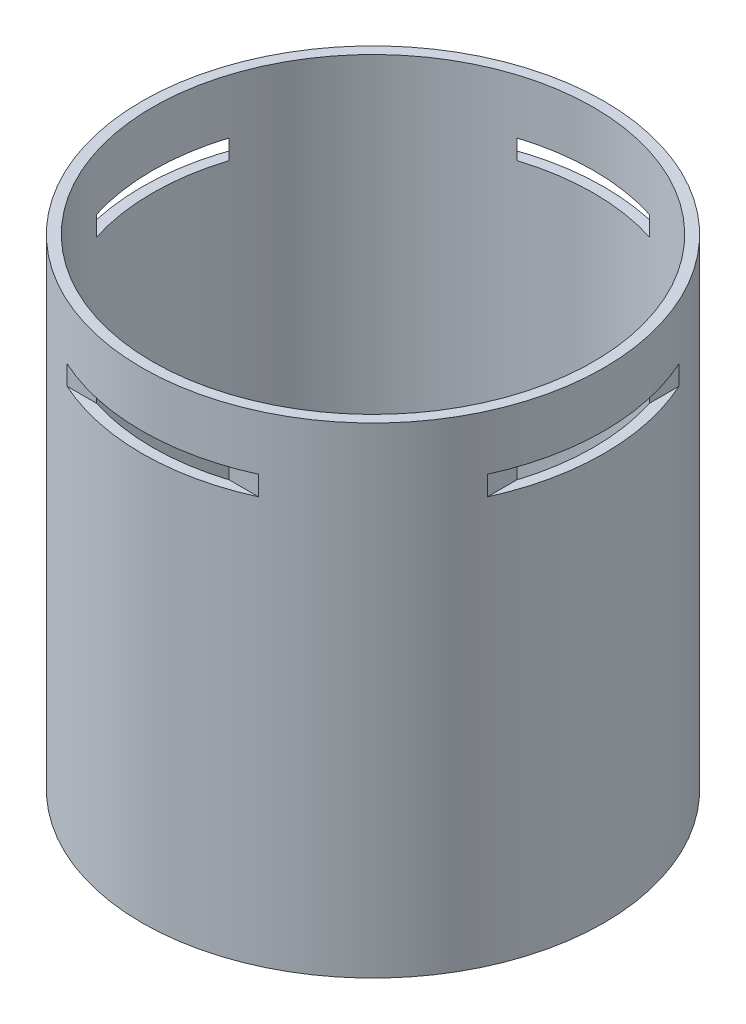
ISO-10303-21;
HEADER;
FILE_DESCRIPTION(('STEP AP214'),'2;1');
FILE_NAME('part.step','',(''),(''),'','','');
FILE_SCHEMA(('AUTOMOTIVE_DESIGN { 1 0 10303 214 1 1 1 1 }'));
ENDSEC;
DATA;
#1=APPLICATION_CONTEXT('core data for automotive mechanical design processes');
#2=APPLICATION_PROTOCOL_DEFINITION('international standard','automotive_design',2000,#1);
#3=PRODUCT_CONTEXT('',#1,'mechanical');
#4=PRODUCT('Part','Part','',(#3));
#5=PRODUCT_RELATED_PRODUCT_CATEGORY('part','',(#4));
#6=PRODUCT_DEFINITION_FORMATION('','',#4);
#7=PRODUCT_DEFINITION_CONTEXT('part definition',#1,'design');
#8=PRODUCT_DEFINITION('design','',#6,#7);
#9=PRODUCT_DEFINITION_SHAPE('','',#8);
#10=(LENGTH_UNIT() NAMED_UNIT(*) SI_UNIT(.MILLI.,.METRE.));
#11=(NAMED_UNIT(*) PLANE_ANGLE_UNIT() SI_UNIT($,.RADIAN.));
#12=(NAMED_UNIT(*) SI_UNIT($,.STERADIAN.) SOLID_ANGLE_UNIT());
#13=UNCERTAINTY_MEASURE_WITH_UNIT(LENGTH_MEASURE(1.E-05),#10,'distance_accuracy_value','');
#14=(GEOMETRIC_REPRESENTATION_CONTEXT(3) GLOBAL_UNCERTAINTY_ASSIGNED_CONTEXT((#13)) GLOBAL_UNIT_ASSIGNED_CONTEXT((#10,
#11,#12)) REPRESENTATION_CONTEXT('',''));
#15=CARTESIAN_POINT('',(0.,0.,0.));
#16=DIRECTION('',(0.,0.,1.));
#17=DIRECTION('',(1.,0.,0.));
#18=AXIS2_PLACEMENT_3D('',#15,#16,#17);
#19=CARTESIAN_POINT('',(0.,61.5,0.));
#20=DIRECTION('',(0.,-1.,0.));
#21=DIRECTION('',(0.,0.,-1.));
#22=AXIS2_PLACEMENT_3D('',#19,#20,#21);
#23=CYLINDRICAL_SURFACE('',#22,29.55);
#24=DIRECTION('',(0.,1.,0.));
#25=VECTOR('',#24,1.);
#26=CARTESIAN_POINT('',(-26.8912625214958,52.00000003,12.2499999999997));
#27=LINE('',#26,#25);
#28=CARTESIAN_POINT('',(-26.8912625214958,52.00000003,12.2499999999997));
#29=VERTEX_POINT('',#28);
#30=CARTESIAN_POINT('',(-26.8912625214958,54.50000003,12.2499999999997));
#31=VERTEX_POINT('',#30);
#32=EDGE_CURVE('E157',#29,#31,#27,.T.);
#33=ORIENTED_EDGE('',*,*,#32,.F.);
#34=CARTESIAN_POINT('',(0.,52.00000003,0.));
#35=DIRECTION('',(0.,1.,0.));
#36=DIRECTION('',(0.,0.,-1.));
#37=AXIS2_PLACEMENT_3D('',#34,#35,#36);
#38=CIRCLE('',#37,29.55);
#39=CARTESIAN_POINT('',(-26.8912625214956,52.00000003,-12.2500000000003));
#40=VERTEX_POINT('',#39);
#41=EDGE_CURVE('E144',#40,#29,#38,.T.);
#42=ORIENTED_EDGE('',*,*,#41,.F.);
#43=DIRECTION('',(0.,1.,0.));
#44=VECTOR('',#43,1.);
#45=CARTESIAN_POINT('',(-26.8912625214956,52.00000003,-12.2500000000003));
#46=LINE('',#45,#44);
#47=CARTESIAN_POINT('',(-26.8912625214956,54.50000003,-12.2500000000003));
#48=VERTEX_POINT('',#47);
#49=EDGE_CURVE('E164',#40,#48,#46,.T.);
#50=ORIENTED_EDGE('',*,*,#49,.T.);
#51=CARTESIAN_POINT('',(0.,54.50000003,0.));
#52=DIRECTION('',(0.,1.,0.));
#53=DIRECTION('',(0.,0.,-1.));
#54=AXIS2_PLACEMENT_3D('',#51,#52,#53);
#55=CIRCLE('',#54,29.55);
#56=EDGE_CURVE('E163',#48,#31,#55,.T.);
#57=ORIENTED_EDGE('',*,*,#56,.T.);
#58=EDGE_LOOP('',(#33,#42,#50,#57));
#59=FACE_BOUND('',#58,.T.);
#60=DIRECTION('',(0.,1.,0.));
#61=VECTOR('',#60,1.);
#62=CARTESIAN_POINT('',(12.2499999999998,52.00000003,26.8912625214958));
#63=LINE('',#62,#61);
#64=CARTESIAN_POINT('',(12.2499999999998,52.00000003,26.8912625214958));
#65=VERTEX_POINT('',#64);
#66=CARTESIAN_POINT('',(12.2499999999998,54.50000003,26.8912625214958));
#67=VERTEX_POINT('',#66);
#68=EDGE_CURVE('E177',#65,#67,#63,.T.);
#69=ORIENTED_EDGE('',*,*,#68,.F.);
#70=CARTESIAN_POINT('',(0.,52.00000003,0.));
#71=DIRECTION('',(0.,1.,0.));
#72=DIRECTION('',(0.,0.,-1.));
#73=AXIS2_PLACEMENT_3D('',#70,#71,#72);
#74=CIRCLE('',#73,29.55);
#75=CARTESIAN_POINT('',(-12.2500000000002,52.00000003,26.8912625214956));
#76=VERTEX_POINT('',#75);
#77=EDGE_CURVE('E170',#76,#65,#74,.T.);
#78=ORIENTED_EDGE('',*,*,#77,.F.);
#79=DIRECTION('',(0.,1.,0.));
#80=VECTOR('',#79,1.);
#81=CARTESIAN_POINT('',(-12.2500000000002,52.00000003,26.8912625214956));
#82=LINE('',#81,#80);
#83=CARTESIAN_POINT('',(-12.2500000000002,54.50000003,26.8912625214956));
#84=VERTEX_POINT('',#83);
#85=EDGE_CURVE('E183',#76,#84,#82,.T.);
#86=ORIENTED_EDGE('',*,*,#85,.T.);
#87=CARTESIAN_POINT('',(0.,54.50000003,0.));
#88=DIRECTION('',(0.,1.,0.));
#89=DIRECTION('',(0.,0.,-1.));
#90=AXIS2_PLACEMENT_3D('',#87,#88,#89);
#91=CIRCLE('',#90,29.55);
#92=EDGE_CURVE('E166',#84,#67,#91,.T.);
#93=ORIENTED_EDGE('',*,*,#92,.T.);
#94=EDGE_LOOP('',(#69,#78,#86,#93));
#95=FACE_BOUND('',#94,.T.);
#96=DIRECTION('',(0.,1.,0.));
#97=VECTOR('',#96,1.);
#98=CARTESIAN_POINT('',(26.8912625214958,52.00000003,-12.2499999999999));
#99=LINE('',#98,#97);
#100=CARTESIAN_POINT('',(26.8912625214958,52.00000003,-12.2499999999999));
#101=VERTEX_POINT('',#100);
#102=CARTESIAN_POINT('',(26.8912625214958,54.50000003,-12.2499999999999));
#103=VERTEX_POINT('',#102);
#104=EDGE_CURVE('E196',#101,#103,#99,.T.);
#105=ORIENTED_EDGE('',*,*,#104,.F.);
#106=CARTESIAN_POINT('',(0.,52.00000003,0.));
#107=DIRECTION('',(0.,1.,0.));
#108=DIRECTION('',(0.,0.,-1.));
#109=AXIS2_PLACEMENT_3D('',#106,#107,#108);
#110=CIRCLE('',#109,29.55);
#111=CARTESIAN_POINT('',(26.8912625214957,52.00000003,12.2500000000001));
#112=VERTEX_POINT('',#111);
#113=EDGE_CURVE('E189',#112,#101,#110,.T.);
#114=ORIENTED_EDGE('',*,*,#113,.F.);
#115=DIRECTION('',(0.,1.,0.));
#116=VECTOR('',#115,1.);
#117=CARTESIAN_POINT('',(26.8912625214957,52.00000003,12.2500000000001));
#118=LINE('',#117,#116);
#119=CARTESIAN_POINT('',(26.8912625214957,54.50000003,12.2500000000001));
#120=VERTEX_POINT('',#119);
#121=EDGE_CURVE('E202',#112,#120,#118,.T.);
#122=ORIENTED_EDGE('',*,*,#121,.T.);
#123=CARTESIAN_POINT('',(0.,54.50000003,0.));
#124=DIRECTION('',(0.,1.,0.));
#125=DIRECTION('',(0.,0.,-1.));
#126=AXIS2_PLACEMENT_3D('',#123,#124,#125);
#127=CIRCLE('',#126,29.55);
#128=EDGE_CURVE('E186',#120,#103,#127,.T.);
#129=ORIENTED_EDGE('',*,*,#128,.T.);
#130=EDGE_LOOP('',(#105,#114,#122,#129));
#131=FACE_BOUND('',#130,.T.);
#132=DIRECTION('',(0.,1.,0.));
#133=VECTOR('',#132,1.);
#134=CARTESIAN_POINT('',(-12.25,52.00000003,-26.8912625214957));
#135=LINE('',#134,#133);
#136=CARTESIAN_POINT('',(-12.25,52.00000003,-26.8912625214957));
#137=VERTEX_POINT('',#136);
#138=CARTESIAN_POINT('',(-12.25,54.50000003,-26.8912625214957));
#139=VERTEX_POINT('',#138);
#140=EDGE_CURVE('E215',#137,#139,#135,.T.);
#141=ORIENTED_EDGE('',*,*,#140,.F.);
#142=CARTESIAN_POINT('',(0.,52.00000003,0.));
#143=DIRECTION('',(0.,1.,0.));
#144=DIRECTION('',(0.,0.,-1.));
#145=AXIS2_PLACEMENT_3D('',#142,#143,#144);
#146=CIRCLE('',#145,29.55);
#147=CARTESIAN_POINT('',(12.25,52.00000003,-26.8912625214957));
#148=VERTEX_POINT('',#147);
#149=EDGE_CURVE('E208',#148,#137,#146,.T.);
#150=ORIENTED_EDGE('',*,*,#149,.F.);
#151=DIRECTION('',(0.,1.,0.));
#152=VECTOR('',#151,1.);
#153=CARTESIAN_POINT('',(12.25,52.00000003,-26.8912625214957));
#154=LINE('',#153,#152);
#155=CARTESIAN_POINT('',(12.25,54.50000003,-26.8912625214957));
#156=VERTEX_POINT('',#155);
#157=EDGE_CURVE('E221',#148,#156,#154,.T.);
#158=ORIENTED_EDGE('',*,*,#157,.T.);
#159=CARTESIAN_POINT('',(0.,54.50000003,0.));
#160=DIRECTION('',(0.,1.,0.));
#161=DIRECTION('',(0.,0.,-1.));
#162=AXIS2_PLACEMENT_3D('',#159,#160,#161);
#163=CIRCLE('',#162,29.55);
#164=EDGE_CURVE('E205',#156,#139,#163,.T.);
#165=ORIENTED_EDGE('',*,*,#164,.T.);
#166=EDGE_LOOP('',(#141,#150,#158,#165));
#167=FACE_BOUND('',#166,.T.);
#168=CARTESIAN_POINT('',(0.,61.5,0.));
#169=DIRECTION('',(0.,1.,0.));
#170=DIRECTION('',(0.,0.,1.));
#171=AXIS2_PLACEMENT_3D('',#168,#169,#170);
#172=CIRCLE('',#171,29.55);
#173=CARTESIAN_POINT('',(0.,61.5,29.55));
#174=VERTEX_POINT('',#173);
#175=EDGE_CURVE('E233',#174,#174,#172,.T.);
#176=ORIENTED_EDGE('',*,*,#175,.F.);
#177=EDGE_LOOP('',(#176));
#178=FACE_BOUND('',#177,.T.);
#179=CARTESIAN_POINT('',(0.,0.,0.));
#180=DIRECTION('',(0.,1.,0.));
#181=DIRECTION('',(0.,0.,1.));
#182=AXIS2_PLACEMENT_3D('',#179,#180,#181);
#183=CIRCLE('',#182,29.55);
#184=CARTESIAN_POINT('',(0.,0.,29.55));
#185=VERTEX_POINT('',#184);
#186=EDGE_CURVE('E230',#185,#185,#183,.T.);
#187=ORIENTED_EDGE('',*,*,#186,.T.);
#188=EDGE_LOOP('',(#187));
#189=FACE_BOUND('',#188,.T.);
#190=ADVANCED_FACE('F33',(#59,#95,#131,#167,#178,#189),#23,.T.);
#191=CARTESIAN_POINT('',(0.,61.5,0.));
#192=DIRECTION('',(0.,1.,0.));
#193=DIRECTION('',(0.,0.,1.));
#194=AXIS2_PLACEMENT_3D('',#191,#192,#193);
#195=PLANE('',#194);
#196=CARTESIAN_POINT('',(0.,61.5,0.));
#197=DIRECTION('',(0.,1.,0.));
#198=DIRECTION('',(0.,0.,1.));
#199=AXIS2_PLACEMENT_3D('',#196,#197,#198);
#200=CIRCLE('',#199,28.2);
#201=CARTESIAN_POINT('',(0.,61.5,28.2));
#202=VERTEX_POINT('',#201);
#203=EDGE_CURVE('E224',#202,#202,#200,.T.);
#204=ORIENTED_EDGE('',*,*,#203,.F.);
#205=EDGE_LOOP('',(#204));
#206=FACE_BOUND('',#205,.T.);
#207=ORIENTED_EDGE('',*,*,#175,.T.);
#208=EDGE_LOOP('',(#207));
#209=FACE_BOUND('',#208,.T.);
#210=ADVANCED_FACE('F290',(#206,#209),#195,.T.);
#211=CARTESIAN_POINT('',(0.,0.,0.));
#212=DIRECTION('',(0.,1.,0.));
#213=DIRECTION('',(0.,0.,1.));
#214=AXIS2_PLACEMENT_3D('',#211,#212,#213);
#215=PLANE('',#214);
#216=CARTESIAN_POINT('',(0.,0.,0.));
#217=DIRECTION('',(0.,1.,0.));
#218=DIRECTION('',(0.,0.,1.));
#219=AXIS2_PLACEMENT_3D('',#216,#217,#218);
#220=CIRCLE('',#219,28.2);
#221=CARTESIAN_POINT('',(0.,0.,28.2));
#222=VERTEX_POINT('',#221);
#223=EDGE_CURVE('E227',#222,#222,#220,.T.);
#224=ORIENTED_EDGE('',*,*,#223,.T.);
#225=EDGE_LOOP('',(#224));
#226=FACE_BOUND('',#225,.T.);
#227=ORIENTED_EDGE('',*,*,#186,.F.);
#228=EDGE_LOOP('',(#227));
#229=FACE_BOUND('',#228,.T.);
#230=ADVANCED_FACE('F294',(#226,#229),#215,.F.);
#231=CARTESIAN_POINT('',(0.,0.,0.));
#232=DIRECTION('',(0.,1.,0.));
#233=DIRECTION('',(0.,0.,1.));
#234=AXIS2_PLACEMENT_3D('',#231,#232,#233);
#235=CYLINDRICAL_SURFACE('',#234,28.2);
#236=DIRECTION('',(0.,1.,0.));
#237=VECTOR('',#236,1.);
#238=CARTESIAN_POINT('',(-26.8912625214956,0.,-8.49117188614179));
#239=LINE('',#238,#237);
#240=CARTESIAN_POINT('',(-26.8912625214956,54.50000003,-8.49117188614179));
#241=VERTEX_POINT('',#240);
#242=CARTESIAN_POINT('',(-26.8912625214956,52.00000003,-8.49117188614179));
#243=VERTEX_POINT('',#242);
#244=EDGE_CURVE('E40',#241,#243,#239,.F.);
#245=ORIENTED_EDGE('',*,*,#244,.T.);
#246=CARTESIAN_POINT('',(0.,52.00000003,0.));
#247=DIRECTION('',(0.,-1.,0.));
#248=DIRECTION('',(0.,0.,-1.));
#249=AXIS2_PLACEMENT_3D('',#246,#247,#248);
#250=CIRCLE('',#249,28.2);
#251=CARTESIAN_POINT('',(-26.8912625214958,52.00000003,8.49117188614123));
#252=VERTEX_POINT('',#251);
#253=EDGE_CURVE('E11',#243,#252,#250,.F.);
#254=ORIENTED_EDGE('',*,*,#253,.T.);
#255=DIRECTION('',(0.,1.,0.));
#256=VECTOR('',#255,1.);
#257=CARTESIAN_POINT('',(-26.8912625214958,0.,8.49117188614123));
#258=LINE('',#257,#256);
#259=CARTESIAN_POINT('',(-26.8912625214958,54.50000003,8.49117188614123));
#260=VERTEX_POINT('',#259);
#261=EDGE_CURVE('E160',#252,#260,#258,.T.);
#262=ORIENTED_EDGE('',*,*,#261,.T.);
#263=CARTESIAN_POINT('',(0.,54.50000003,0.));
#264=DIRECTION('',(0.,-1.,0.));
#265=DIRECTION('',(0.,0.,-1.));
#266=AXIS2_PLACEMENT_3D('',#263,#264,#265);
#267=CIRCLE('',#266,28.2);
#268=EDGE_CURVE('E271',#241,#260,#267,.F.);
#269=ORIENTED_EDGE('',*,*,#268,.F.);
#270=EDGE_LOOP('',(#245,#254,#262,#269));
#271=FACE_BOUND('',#270,.T.);
#272=DIRECTION('',(0.,1.,0.));
#273=VECTOR('',#272,1.);
#274=CARTESIAN_POINT('',(-8.49117188614168,0.,26.8912625214957));
#275=LINE('',#274,#273);
#276=CARTESIAN_POINT('',(-8.49117188614168,54.50000003,26.8912625214957));
#277=VERTEX_POINT('',#276);
#278=CARTESIAN_POINT('',(-8.49117188614168,52.00000003,26.8912625214957));
#279=VERTEX_POINT('',#278);
#280=EDGE_CURVE('E265',#277,#279,#275,.F.);
#281=ORIENTED_EDGE('',*,*,#280,.T.);
#282=CARTESIAN_POINT('',(0.,52.00000003,0.));
#283=DIRECTION('',(0.,-1.,0.));
#284=DIRECTION('',(0.,0.,-1.));
#285=AXIS2_PLACEMENT_3D('',#282,#283,#284);
#286=CIRCLE('',#285,28.2);
#287=CARTESIAN_POINT('',(8.4911718861413,52.00000003,26.8912625214958));
#288=VERTEX_POINT('',#287);
#289=EDGE_CURVE('E268',#279,#288,#286,.F.);
#290=ORIENTED_EDGE('',*,*,#289,.T.);
#291=DIRECTION('',(0.,1.,0.));
#292=VECTOR('',#291,1.);
#293=CARTESIAN_POINT('',(8.4911718861413,0.,26.8912625214958));
#294=LINE('',#293,#292);
#295=CARTESIAN_POINT('',(8.4911718861413,54.50000003,26.8912625214958));
#296=VERTEX_POINT('',#295);
#297=EDGE_CURVE('E262',#288,#296,#294,.T.);
#298=ORIENTED_EDGE('',*,*,#297,.T.);
#299=CARTESIAN_POINT('',(0.,54.50000003,0.));
#300=DIRECTION('',(0.,-1.,0.));
#301=DIRECTION('',(0.,0.,-1.));
#302=AXIS2_PLACEMENT_3D('',#299,#300,#301);
#303=CIRCLE('',#302,28.2);
#304=EDGE_CURVE('E260',#277,#296,#303,.F.);
#305=ORIENTED_EDGE('',*,*,#304,.F.);
#306=EDGE_LOOP('',(#281,#290,#298,#305));
#307=FACE_BOUND('',#306,.T.);
#308=DIRECTION('',(0.,1.,0.));
#309=VECTOR('',#308,1.);
#310=CARTESIAN_POINT('',(26.8912625214957,0.,8.4911718861416));
#311=LINE('',#310,#309);
#312=CARTESIAN_POINT('',(26.8912625214957,54.50000003,8.4911718861416));
#313=VERTEX_POINT('',#312);
#314=CARTESIAN_POINT('',(26.8912625214957,52.00000003,8.4911718861416));
#315=VERTEX_POINT('',#314);
#316=EDGE_CURVE('E254',#313,#315,#311,.F.);
#317=ORIENTED_EDGE('',*,*,#316,.T.);
#318=CARTESIAN_POINT('',(0.,52.00000003,0.));
#319=DIRECTION('',(0.,-1.,0.));
#320=DIRECTION('',(0.,0.,-1.));
#321=AXIS2_PLACEMENT_3D('',#318,#319,#320);
#322=CIRCLE('',#321,28.2);
#323=CARTESIAN_POINT('',(26.8912625214957,52.00000003,-8.49117188614142));
#324=VERTEX_POINT('',#323);
#325=EDGE_CURVE('E257',#315,#324,#322,.F.);
#326=ORIENTED_EDGE('',*,*,#325,.T.);
#327=DIRECTION('',(0.,1.,0.));
#328=VECTOR('',#327,1.);
#329=CARTESIAN_POINT('',(26.8912625214957,0.,-8.49117188614142));
#330=LINE('',#329,#328);
#331=CARTESIAN_POINT('',(26.8912625214957,54.50000003,-8.49117188614142));
#332=VERTEX_POINT('',#331);
#333=EDGE_CURVE('E251',#324,#332,#330,.T.);
#334=ORIENTED_EDGE('',*,*,#333,.T.);
#335=CARTESIAN_POINT('',(0.,54.50000003,0.));
#336=DIRECTION('',(0.,-1.,0.));
#337=DIRECTION('',(0.,0.,-1.));
#338=AXIS2_PLACEMENT_3D('',#335,#336,#337);
#339=CIRCLE('',#338,28.2);
#340=EDGE_CURVE('E249',#313,#332,#339,.F.);
#341=ORIENTED_EDGE('',*,*,#340,.F.);
#342=EDGE_LOOP('',(#317,#326,#334,#341));
#343=FACE_BOUND('',#342,.T.);
#344=DIRECTION('',(0.,1.,0.));
#345=VECTOR('',#344,1.);
#346=CARTESIAN_POINT('',(8.49117188614151,0.,-26.8912625214957));
#347=LINE('',#346,#345);
#348=CARTESIAN_POINT('',(8.49117188614151,54.50000003,-26.8912625214957));
#349=VERTEX_POINT('',#348);
#350=CARTESIAN_POINT('',(8.49117188614151,52.00000003,-26.8912625214957));
#351=VERTEX_POINT('',#350);
#352=EDGE_CURVE('E243',#349,#351,#347,.F.);
#353=ORIENTED_EDGE('',*,*,#352,.T.);
#354=CARTESIAN_POINT('',(0.,52.00000003,0.));
#355=DIRECTION('',(0.,-1.,0.));
#356=DIRECTION('',(0.,0.,-1.));
#357=AXIS2_PLACEMENT_3D('',#354,#355,#356);
#358=CIRCLE('',#357,28.2);
#359=CARTESIAN_POINT('',(-8.49117188614151,52.00000003,-26.8912625214957));
#360=VERTEX_POINT('',#359);
#361=EDGE_CURVE('E246',#351,#360,#358,.F.);
#362=ORIENTED_EDGE('',*,*,#361,.T.);
#363=DIRECTION('',(0.,1.,0.));
#364=VECTOR('',#363,1.);
#365=CARTESIAN_POINT('',(-8.49117188614151,0.,-26.8912625214957));
#366=LINE('',#365,#364);
#367=CARTESIAN_POINT('',(-8.49117188614151,54.50000003,-26.8912625214957));
#368=VERTEX_POINT('',#367);
#369=EDGE_CURVE('E240',#360,#368,#366,.T.);
#370=ORIENTED_EDGE('',*,*,#369,.T.);
#371=CARTESIAN_POINT('',(0.,54.50000003,0.));
#372=DIRECTION('',(0.,-1.,0.));
#373=DIRECTION('',(0.,0.,-1.));
#374=AXIS2_PLACEMENT_3D('',#371,#372,#373);
#375=CIRCLE('',#374,28.2);
#376=EDGE_CURVE('E236',#349,#368,#375,.F.);
#377=ORIENTED_EDGE('',*,*,#376,.F.);
#378=EDGE_LOOP('',(#353,#362,#370,#377));
#379=FACE_BOUND('',#378,.T.);
#380=ORIENTED_EDGE('',*,*,#223,.F.);
#381=EDGE_LOOP('',(#380));
#382=FACE_BOUND('',#381,.T.);
#383=ORIENTED_EDGE('',*,*,#203,.T.);
#384=EDGE_LOOP('',(#383));
#385=FACE_BOUND('',#384,.T.);
#386=ADVANCED_FACE('F276',(#271,#307,#343,#379,#382,#385),#235,.F.);
#387=CARTESIAN_POINT('',(-12.25,52.00000003,-26.8912625214957));
#388=DIRECTION('',(0.,0.,1.));
#389=DIRECTION('',(1.,0.,0.));
#390=AXIS2_PLACEMENT_3D('',#387,#388,#389);
#391=PLANE('',#390);
#392=DIRECTION('',(1.,0.,0.));
#393=VECTOR('',#392,1.);
#394=CARTESIAN_POINT('',(-12.25,54.50000003,-26.8912625214957));
#395=LINE('',#394,#393);
#396=EDGE_CURVE('E218',#349,#156,#395,.T.);
#397=ORIENTED_EDGE('',*,*,#396,.T.);
#398=ORIENTED_EDGE('',*,*,#157,.F.);
#399=DIRECTION('',(1.,0.,0.));
#400=VECTOR('',#399,1.);
#401=CARTESIAN_POINT('',(-12.25,52.00000003,-26.8912625214957));
#402=LINE('',#401,#400);
#403=EDGE_CURVE('E210',#351,#148,#402,.T.);
#404=ORIENTED_EDGE('',*,*,#403,.F.);
#405=ORIENTED_EDGE('',*,*,#352,.F.);
#406=EDGE_LOOP('',(#397,#398,#404,#405));
#407=FACE_BOUND('',#406,.T.);
#408=ADVANCED_FACE('F306',(#407),#391,.F.);
#409=EDGE_CURVE('E212',#137,#360,#402,.T.);
#410=ORIENTED_EDGE('',*,*,#409,.F.);
#411=ORIENTED_EDGE('',*,*,#140,.T.);
#412=EDGE_CURVE('E211',#139,#368,#395,.T.);
#413=ORIENTED_EDGE('',*,*,#412,.T.);
#414=ORIENTED_EDGE('',*,*,#369,.F.);
#415=EDGE_LOOP('',(#410,#411,#413,#414));
#416=FACE_BOUND('',#415,.T.);
#417=ADVANCED_FACE('F309',(#416),#391,.F.);
#418=CARTESIAN_POINT('',(0.,52.00000003,0.));
#419=DIRECTION('',(0.,-1.,0.));
#420=DIRECTION('',(0.,0.,-1.));
#421=AXIS2_PLACEMENT_3D('',#418,#419,#420);
#422=PLANE('',#421);
#423=ORIENTED_EDGE('',*,*,#403,.T.);
#424=ORIENTED_EDGE('',*,*,#149,.T.);
#425=ORIENTED_EDGE('',*,*,#409,.T.);
#426=ORIENTED_EDGE('',*,*,#361,.F.);
#427=EDGE_LOOP('',(#423,#424,#425,#426));
#428=FACE_BOUND('',#427,.T.);
#429=ADVANCED_FACE('F315',(#428),#422,.F.);
#430=CARTESIAN_POINT('',(0.,54.50000003,0.));
#431=DIRECTION('',(0.,-1.,0.));
#432=DIRECTION('',(0.,0.,-1.));
#433=AXIS2_PLACEMENT_3D('',#430,#431,#432);
#434=PLANE('',#433);
#435=ORIENTED_EDGE('',*,*,#376,.T.);
#436=ORIENTED_EDGE('',*,*,#412,.F.);
#437=ORIENTED_EDGE('',*,*,#164,.F.);
#438=ORIENTED_EDGE('',*,*,#396,.F.);
#439=EDGE_LOOP('',(#435,#436,#437,#438));
#440=FACE_BOUND('',#439,.T.);
#441=ADVANCED_FACE('F311',(#440),#434,.T.);
#442=CARTESIAN_POINT('',(26.8912625214958,52.00000003,-12.2499999999999));
#443=DIRECTION('',(-1.,0.,0.));
#444=DIRECTION('',(0.,0.,1.));
#445=AXIS2_PLACEMENT_3D('',#442,#443,#444);
#446=PLANE('',#445);
#447=DIRECTION('',(0.,0.,1.));
#448=VECTOR('',#447,1.);
#449=CARTESIAN_POINT('',(26.8912625214958,54.50000003,-12.2499999999999));
#450=LINE('',#449,#448);
#451=EDGE_CURVE('E199',#313,#120,#450,.T.);
#452=ORIENTED_EDGE('',*,*,#451,.T.);
#453=ORIENTED_EDGE('',*,*,#121,.F.);
#454=DIRECTION('',(0.,0.,1.));
#455=VECTOR('',#454,1.);
#456=CARTESIAN_POINT('',(26.8912625214958,52.00000003,-12.2499999999999));
#457=LINE('',#456,#455);
#458=EDGE_CURVE('E191',#315,#112,#457,.T.);
#459=ORIENTED_EDGE('',*,*,#458,.F.);
#460=ORIENTED_EDGE('',*,*,#316,.F.);
#461=EDGE_LOOP('',(#452,#453,#459,#460));
#462=FACE_BOUND('',#461,.T.);
#463=ADVANCED_FACE('F314',(#462),#446,.F.);
#464=EDGE_CURVE('E193',#101,#324,#457,.T.);
#465=ORIENTED_EDGE('',*,*,#464,.F.);
#466=ORIENTED_EDGE('',*,*,#104,.T.);
#467=EDGE_CURVE('E192',#103,#332,#450,.T.);
#468=ORIENTED_EDGE('',*,*,#467,.T.);
#469=ORIENTED_EDGE('',*,*,#333,.F.);
#470=EDGE_LOOP('',(#465,#466,#468,#469));
#471=FACE_BOUND('',#470,.T.);
#472=ADVANCED_FACE('F322',(#471),#446,.F.);
#473=CARTESIAN_POINT('',(0.,52.00000003,0.));
#474=DIRECTION('',(0.,-1.,0.));
#475=DIRECTION('',(0.,0.,-1.));
#476=AXIS2_PLACEMENT_3D('',#473,#474,#475);
#477=PLANE('',#476);
#478=ORIENTED_EDGE('',*,*,#458,.T.);
#479=ORIENTED_EDGE('',*,*,#113,.T.);
#480=ORIENTED_EDGE('',*,*,#464,.T.);
#481=ORIENTED_EDGE('',*,*,#325,.F.);
#482=EDGE_LOOP('',(#478,#479,#480,#481));
#483=FACE_BOUND('',#482,.T.);
#484=ADVANCED_FACE('F328',(#483),#477,.F.);
#485=CARTESIAN_POINT('',(0.,54.50000003,0.));
#486=DIRECTION('',(0.,-1.,0.));
#487=DIRECTION('',(0.,0.,-1.));
#488=AXIS2_PLACEMENT_3D('',#485,#486,#487);
#489=PLANE('',#488);
#490=ORIENTED_EDGE('',*,*,#340,.T.);
#491=ORIENTED_EDGE('',*,*,#467,.F.);
#492=ORIENTED_EDGE('',*,*,#128,.F.);
#493=ORIENTED_EDGE('',*,*,#451,.F.);
#494=EDGE_LOOP('',(#490,#491,#492,#493));
#495=FACE_BOUND('',#494,.T.);
#496=ADVANCED_FACE('F324',(#495),#489,.T.);
#497=CARTESIAN_POINT('',(12.2499999999998,52.00000003,26.8912625214958));
#498=DIRECTION('',(0.,0.,-1.));
#499=DIRECTION('',(-1.,0.,0.));
#500=AXIS2_PLACEMENT_3D('',#497,#498,#499);
#501=PLANE('',#500);
#502=DIRECTION('',(-1.,0.,0.));
#503=VECTOR('',#502,1.);
#504=CARTESIAN_POINT('',(12.2499999999998,54.50000003,26.8912625214958));
#505=LINE('',#504,#503);
#506=EDGE_CURVE('E180',#277,#84,#505,.T.);
#507=ORIENTED_EDGE('',*,*,#506,.T.);
#508=ORIENTED_EDGE('',*,*,#85,.F.);
#509=DIRECTION('',(-1.,0.,0.));
#510=VECTOR('',#509,1.);
#511=CARTESIAN_POINT('',(12.2499999999998,52.00000003,26.8912625214958));
#512=LINE('',#511,#510);
#513=EDGE_CURVE('E172',#279,#76,#512,.T.);
#514=ORIENTED_EDGE('',*,*,#513,.F.);
#515=ORIENTED_EDGE('',*,*,#280,.F.);
#516=EDGE_LOOP('',(#507,#508,#514,#515));
#517=FACE_BOUND('',#516,.T.);
#518=ADVANCED_FACE('F327',(#517),#501,.F.);
#519=EDGE_CURVE('E174',#65,#288,#512,.T.);
#520=ORIENTED_EDGE('',*,*,#519,.F.);
#521=ORIENTED_EDGE('',*,*,#68,.T.);
#522=EDGE_CURVE('E173',#67,#296,#505,.T.);
#523=ORIENTED_EDGE('',*,*,#522,.T.);
#524=ORIENTED_EDGE('',*,*,#297,.F.);
#525=EDGE_LOOP('',(#520,#521,#523,#524));
#526=FACE_BOUND('',#525,.T.);
#527=ADVANCED_FACE('F335',(#526),#501,.F.);
#528=CARTESIAN_POINT('',(0.,52.00000003,0.));
#529=DIRECTION('',(0.,-1.,0.));
#530=DIRECTION('',(0.,0.,-1.));
#531=AXIS2_PLACEMENT_3D('',#528,#529,#530);
#532=PLANE('',#531);
#533=ORIENTED_EDGE('',*,*,#513,.T.);
#534=ORIENTED_EDGE('',*,*,#77,.T.);
#535=ORIENTED_EDGE('',*,*,#519,.T.);
#536=ORIENTED_EDGE('',*,*,#289,.F.);
#537=EDGE_LOOP('',(#533,#534,#535,#536));
#538=FACE_BOUND('',#537,.T.);
#539=ADVANCED_FACE('F340',(#538),#532,.F.);
#540=CARTESIAN_POINT('',(0.,54.50000003,0.));
#541=DIRECTION('',(0.,-1.,0.));
#542=DIRECTION('',(0.,0.,-1.));
#543=AXIS2_PLACEMENT_3D('',#540,#541,#542);
#544=PLANE('',#543);
#545=ORIENTED_EDGE('',*,*,#304,.T.);
#546=ORIENTED_EDGE('',*,*,#522,.F.);
#547=ORIENTED_EDGE('',*,*,#92,.F.);
#548=ORIENTED_EDGE('',*,*,#506,.F.);
#549=EDGE_LOOP('',(#545,#546,#547,#548));
#550=FACE_BOUND('',#549,.T.);
#551=ADVANCED_FACE('F337',(#550),#544,.T.);
#552=CARTESIAN_POINT('',(-26.8912625214958,52.00000003,12.2499999999997));
#553=DIRECTION('',(1.,0.,0.));
#554=DIRECTION('',(0.,0.,-1.));
#555=AXIS2_PLACEMENT_3D('',#552,#553,#554);
#556=PLANE('',#555);
#557=DIRECTION('',(0.,0.,-1.));
#558=VECTOR('',#557,1.);
#559=CARTESIAN_POINT('',(-26.8912625214958,54.50000003,12.2499999999997));
#560=LINE('',#559,#558);
#561=EDGE_CURVE('E52',#241,#48,#560,.T.);
#562=ORIENTED_EDGE('',*,*,#561,.T.);
#563=ORIENTED_EDGE('',*,*,#49,.F.);
#564=DIRECTION('',(0.,0.,-1.));
#565=VECTOR('',#564,1.);
#566=CARTESIAN_POINT('',(-26.8912625214958,52.00000003,12.2499999999997));
#567=LINE('',#566,#565);
#568=EDGE_CURVE('E149',#243,#40,#567,.T.);
#569=ORIENTED_EDGE('',*,*,#568,.F.);
#570=ORIENTED_EDGE('',*,*,#244,.F.);
#571=EDGE_LOOP('',(#562,#563,#569,#570));
#572=FACE_BOUND('',#571,.T.);
#573=ADVANCED_FACE('F279',(#572),#556,.F.);
#574=EDGE_CURVE('E147',#29,#252,#567,.T.);
#575=ORIENTED_EDGE('',*,*,#574,.F.);
#576=ORIENTED_EDGE('',*,*,#32,.T.);
#577=EDGE_CURVE('E47',#31,#260,#560,.T.);
#578=ORIENTED_EDGE('',*,*,#577,.T.);
#579=ORIENTED_EDGE('',*,*,#261,.F.);
#580=EDGE_LOOP('',(#575,#576,#578,#579));
#581=FACE_BOUND('',#580,.T.);
#582=ADVANCED_FACE('F156',(#581),#556,.F.);
#583=CARTESIAN_POINT('',(0.,52.00000003,0.));
#584=DIRECTION('',(0.,-1.,0.));
#585=DIRECTION('',(0.,0.,-1.));
#586=AXIS2_PLACEMENT_3D('',#583,#584,#585);
#587=PLANE('',#586);
#588=ORIENTED_EDGE('',*,*,#568,.T.);
#589=ORIENTED_EDGE('',*,*,#41,.T.);
#590=ORIENTED_EDGE('',*,*,#574,.T.);
#591=ORIENTED_EDGE('',*,*,#253,.F.);
#592=EDGE_LOOP('',(#588,#589,#590,#591));
#593=FACE_BOUND('',#592,.T.);
#594=ADVANCED_FACE('F146',(#593),#587,.F.);
#595=CARTESIAN_POINT('',(0.,54.50000003,0.));
#596=DIRECTION('',(0.,-1.,0.));
#597=DIRECTION('',(0.,0.,-1.));
#598=AXIS2_PLACEMENT_3D('',#595,#596,#597);
#599=PLANE('',#598);
#600=ORIENTED_EDGE('',*,*,#268,.T.);
#601=ORIENTED_EDGE('',*,*,#577,.F.);
#602=ORIENTED_EDGE('',*,*,#56,.F.);
#603=ORIENTED_EDGE('',*,*,#561,.F.);
#604=EDGE_LOOP('',(#600,#601,#602,#603));
#605=FACE_BOUND('',#604,.T.);
#606=ADVANCED_FACE('F281',(#605),#599,.T.);
#607=CLOSED_SHELL('',(#190,#210,#230,#386,#408,#417,#429,#441,#463,#472,#484,#496,#518,#527,
#539,#551,#573,#582,#594,#606));
#608=MANIFOLD_SOLID_BREP('B2',#607);
#609=ADVANCED_BREP_SHAPE_REPRESENTATION('',(#18,#608),#14);
#610=SHAPE_DEFINITION_REPRESENTATION(#9,#609);
ENDSEC;
END-ISO-10303-21;
